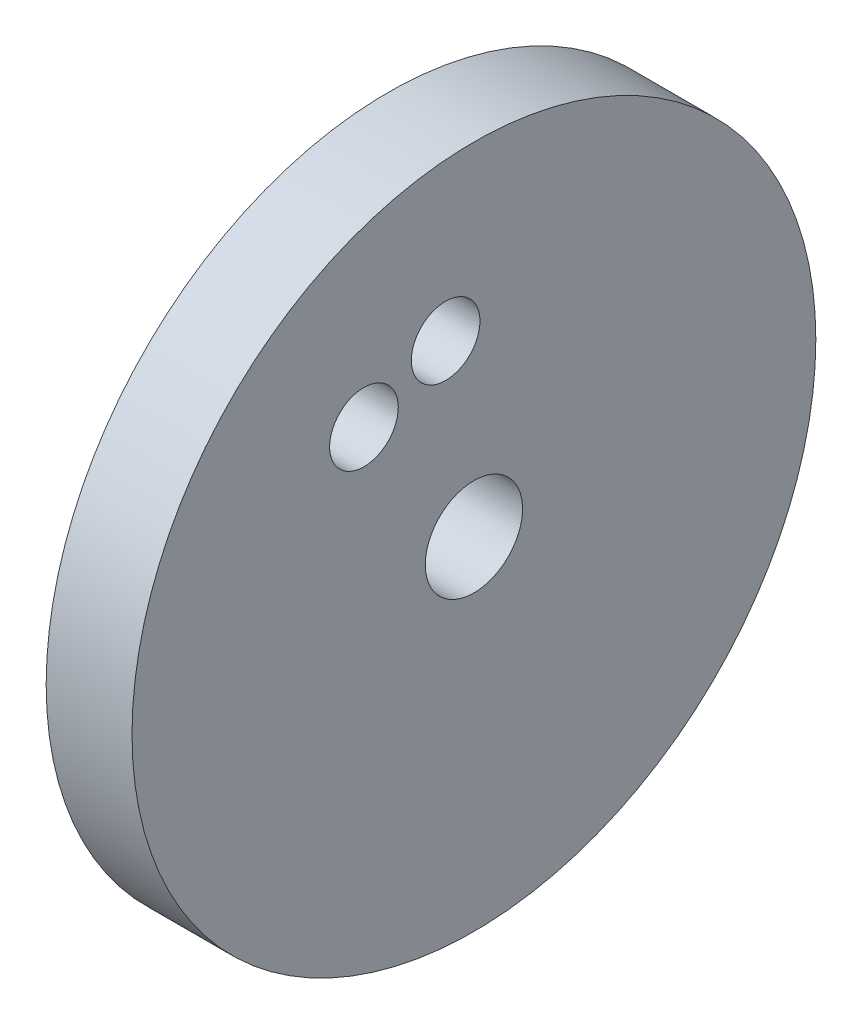
ISO-10303-21;
HEADER;
FILE_DESCRIPTION(('STEP AP214'),'2;1');
FILE_NAME('part.step','',(''),(''),'','','');
FILE_SCHEMA(('AUTOMOTIVE_DESIGN { 1 0 10303 214 1 1 1 1 }'));
ENDSEC;
DATA;
#1=APPLICATION_CONTEXT('core data for automotive mechanical design processes');
#2=APPLICATION_PROTOCOL_DEFINITION('international standard','automotive_design',2000,#1);
#3=PRODUCT_CONTEXT('',#1,'mechanical');
#4=PRODUCT('Part','Part','',(#3));
#5=PRODUCT_RELATED_PRODUCT_CATEGORY('part','',(#4));
#6=PRODUCT_DEFINITION_FORMATION('','',#4);
#7=PRODUCT_DEFINITION_CONTEXT('part definition',#1,'design');
#8=PRODUCT_DEFINITION('design','',#6,#7);
#9=PRODUCT_DEFINITION_SHAPE('','',#8);
#10=(LENGTH_UNIT() NAMED_UNIT(*) SI_UNIT(.MILLI.,.METRE.));
#11=(NAMED_UNIT(*) PLANE_ANGLE_UNIT() SI_UNIT($,.RADIAN.));
#12=(NAMED_UNIT(*) SI_UNIT($,.STERADIAN.) SOLID_ANGLE_UNIT());
#13=UNCERTAINTY_MEASURE_WITH_UNIT(LENGTH_MEASURE(1.E-05),#10,'distance_accuracy_value','');
#14=(GEOMETRIC_REPRESENTATION_CONTEXT(3) GLOBAL_UNCERTAINTY_ASSIGNED_CONTEXT((#13)) GLOBAL_UNIT_ASSIGNED_CONTEXT((#10,
#11,#12)) REPRESENTATION_CONTEXT('',''));
#15=CARTESIAN_POINT('',(0.,0.,0.));
#16=DIRECTION('',(0.,0.,1.));
#17=DIRECTION('',(1.,0.,0.));
#18=AXIS2_PLACEMENT_3D('',#15,#16,#17);
#19=CARTESIAN_POINT('',(73.,23.9,0.));
#20=DIRECTION('',(1.,0.,0.));
#21=DIRECTION('',(0.,0.,-1.));
#22=AXIS2_PLACEMENT_3D('',#19,#20,#21);
#23=PLANE('',#22);
#24=CARTESIAN_POINT('',(73.,12.8487337040411,1.97738266469541));
#25=DIRECTION('',(1.,0.,0.));
#26=DIRECTION('',(0.,0.,-1.));
#27=AXIS2_PLACEMENT_3D('',#24,#25,#26);
#28=CIRCLE('',#27,2.4);
#29=CARTESIAN_POINT('',(73.,12.8487337040411,-0.422617335304591));
#30=VERTEX_POINT('',#29);
#31=EDGE_CURVE('E50',#30,#30,#28,.F.);
#32=ORIENTED_EDGE('',*,*,#31,.F.);
#33=EDGE_LOOP('',(#32));
#34=FACE_BOUND('',#33,.T.);
#35=CARTESIAN_POINT('',(73.,10.4836474229945,7.68720604058077));
#36=DIRECTION('',(1.,0.,0.));
#37=DIRECTION('',(0.,0.,-1.));
#38=AXIS2_PLACEMENT_3D('',#35,#36,#37);
#39=CIRCLE('',#38,2.4);
#40=CARTESIAN_POINT('',(73.,10.4836474229945,5.28720604058077));
#41=VERTEX_POINT('',#40);
#42=EDGE_CURVE('E53',#41,#41,#39,.F.);
#43=ORIENTED_EDGE('',*,*,#42,.F.);
#44=EDGE_LOOP('',(#43));
#45=FACE_BOUND('',#44,.T.);
#46=CARTESIAN_POINT('',(73.,0.,0.));
#47=DIRECTION('',(-1.,0.,0.));
#48=DIRECTION('',(0.,0.,1.));
#49=AXIS2_PLACEMENT_3D('',#46,#47,#48);
#50=CIRCLE('',#49,3.4);
#51=CARTESIAN_POINT('',(73.,0.,3.4));
#52=VERTEX_POINT('',#51);
#53=EDGE_CURVE('E10',#52,#52,#50,.T.);
#54=ORIENTED_EDGE('',*,*,#53,.F.);
#55=EDGE_LOOP('',(#54));
#56=FACE_BOUND('',#55,.T.);
#57=CARTESIAN_POINT('',(73.,0.,0.));
#58=DIRECTION('',(-1.,0.,0.));
#59=DIRECTION('',(0.,0.,1.));
#60=AXIS2_PLACEMENT_3D('',#57,#58,#59);
#61=CIRCLE('',#60,23.9);
#62=CARTESIAN_POINT('',(73.,0.,23.9));
#63=VERTEX_POINT('',#62);
#64=EDGE_CURVE('E45',#63,#63,#61,.T.);
#65=ORIENTED_EDGE('',*,*,#64,.T.);
#66=EDGE_LOOP('',(#65));
#67=FACE_BOUND('',#66,.T.);
#68=ADVANCED_FACE('F31',(#34,#45,#56,#67),#23,.F.);
#69=CARTESIAN_POINT('',(-110.,0.,0.));
#70=DIRECTION('',(-1.,0.,0.));
#71=DIRECTION('',(0.,0.,1.));
#72=AXIS2_PLACEMENT_3D('',#69,#70,#71);
#73=CYLINDRICAL_SURFACE('',#72,3.4);
#74=CARTESIAN_POINT('',(79.,0.,0.));
#75=DIRECTION('',(-1.,0.,0.));
#76=DIRECTION('',(0.,0.,1.));
#77=AXIS2_PLACEMENT_3D('',#74,#75,#76);
#78=CIRCLE('',#77,3.4);
#79=CARTESIAN_POINT('',(79.,0.,3.4));
#80=VERTEX_POINT('',#79);
#81=EDGE_CURVE('E37',#80,#80,#78,.T.);
#82=ORIENTED_EDGE('',*,*,#81,.F.);
#83=EDGE_LOOP('',(#82));
#84=FACE_BOUND('',#83,.T.);
#85=ORIENTED_EDGE('',*,*,#53,.T.);
#86=EDGE_LOOP('',(#85));
#87=FACE_BOUND('',#86,.T.);
#88=ADVANCED_FACE('F70',(#84,#87),#73,.F.);
#89=CARTESIAN_POINT('',(79.,3.4,0.));
#90=DIRECTION('',(-1.,0.,0.));
#91=DIRECTION('',(0.,0.,1.));
#92=AXIS2_PLACEMENT_3D('',#89,#90,#91);
#93=PLANE('',#92);
#94=CARTESIAN_POINT('',(79.,12.8487337040411,1.97738266469541));
#95=DIRECTION('',(1.,0.,0.));
#96=DIRECTION('',(0.,0.,-1.));
#97=AXIS2_PLACEMENT_3D('',#94,#95,#96);
#98=CIRCLE('',#97,2.4);
#99=CARTESIAN_POINT('',(79.,12.8487337040411,-0.422617335304591));
#100=VERTEX_POINT('',#99);
#101=EDGE_CURVE('E56',#100,#100,#98,.T.);
#102=ORIENTED_EDGE('',*,*,#101,.F.);
#103=EDGE_LOOP('',(#102));
#104=FACE_BOUND('',#103,.T.);
#105=CARTESIAN_POINT('',(79.,10.4836474229945,7.68720604058077));
#106=DIRECTION('',(1.,0.,0.));
#107=DIRECTION('',(0.,0.,-1.));
#108=AXIS2_PLACEMENT_3D('',#105,#106,#107);
#109=CIRCLE('',#108,2.4);
#110=CARTESIAN_POINT('',(79.,10.4836474229945,5.28720604058077));
#111=VERTEX_POINT('',#110);
#112=EDGE_CURVE('E57',#111,#111,#109,.T.);
#113=ORIENTED_EDGE('',*,*,#112,.F.);
#114=EDGE_LOOP('',(#113));
#115=FACE_BOUND('',#114,.T.);
#116=CARTESIAN_POINT('',(79.,0.,0.));
#117=DIRECTION('',(-1.,0.,0.));
#118=DIRECTION('',(0.,0.,1.));
#119=AXIS2_PLACEMENT_3D('',#116,#117,#118);
#120=CIRCLE('',#119,23.9);
#121=CARTESIAN_POINT('',(79.,0.,23.9));
#122=VERTEX_POINT('',#121);
#123=EDGE_CURVE('E41',#122,#122,#120,.T.);
#124=ORIENTED_EDGE('',*,*,#123,.F.);
#125=EDGE_LOOP('',(#124));
#126=FACE_BOUND('',#125,.T.);
#127=ORIENTED_EDGE('',*,*,#81,.T.);
#128=EDGE_LOOP('',(#127));
#129=FACE_BOUND('',#128,.T.);
#130=ADVANCED_FACE('F66',(#104,#115,#126,#129),#93,.F.);
#131=CARTESIAN_POINT('',(-110.,0.,0.));
#132=DIRECTION('',(-1.,0.,0.));
#133=DIRECTION('',(0.,0.,1.));
#134=AXIS2_PLACEMENT_3D('',#131,#132,#133);
#135=CYLINDRICAL_SURFACE('',#134,23.9);
#136=ORIENTED_EDGE('',*,*,#64,.F.);
#137=EDGE_LOOP('',(#136));
#138=FACE_BOUND('',#137,.T.);
#139=ORIENTED_EDGE('',*,*,#123,.T.);
#140=EDGE_LOOP('',(#139));
#141=FACE_BOUND('',#140,.T.);
#142=ADVANCED_FACE('F69',(#138,#141),#135,.T.);
#143=CARTESIAN_POINT('',(73.,10.4836474229945,7.68720604058077));
#144=DIRECTION('',(-1.,0.,0.));
#145=DIRECTION('',(0.,0.,1.));
#146=AXIS2_PLACEMENT_3D('',#143,#144,#145);
#147=CYLINDRICAL_SURFACE('',#146,2.4);
#148=ORIENTED_EDGE('',*,*,#112,.T.);
#149=EDGE_LOOP('',(#148));
#150=FACE_BOUND('',#149,.T.);
#151=ORIENTED_EDGE('',*,*,#42,.T.);
#152=EDGE_LOOP('',(#151));
#153=FACE_BOUND('',#152,.T.);
#154=ADVANCED_FACE('F77',(#150,#153),#147,.F.);
#155=CARTESIAN_POINT('',(73.,12.8487337040411,1.97738266469541));
#156=DIRECTION('',(-1.,0.,0.));
#157=DIRECTION('',(0.,0.,1.));
#158=AXIS2_PLACEMENT_3D('',#155,#156,#157);
#159=CYLINDRICAL_SURFACE('',#158,2.4);
#160=ORIENTED_EDGE('',*,*,#101,.T.);
#161=EDGE_LOOP('',(#160));
#162=FACE_BOUND('',#161,.T.);
#163=ORIENTED_EDGE('',*,*,#31,.T.);
#164=EDGE_LOOP('',(#163));
#165=FACE_BOUND('',#164,.T.);
#166=ADVANCED_FACE('F63',(#162,#165),#159,.F.);
#167=CLOSED_SHELL('',(#68,#88,#130,#142,#154,#166));
#168=MANIFOLD_SOLID_BREP('B2',#167);
#169=ADVANCED_BREP_SHAPE_REPRESENTATION('',(#18,#168),#14);
#170=SHAPE_DEFINITION_REPRESENTATION(#9,#169);
ENDSEC;
END-ISO-10303-21;
